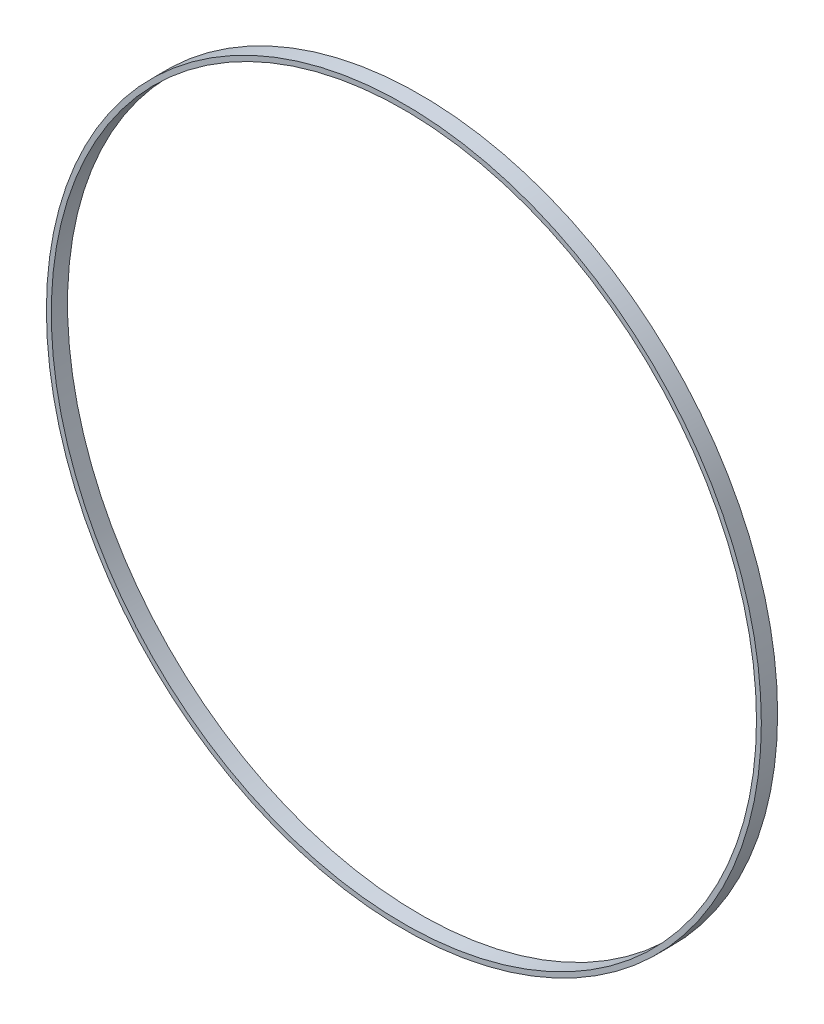
ISO-10303-21;
HEADER;
FILE_DESCRIPTION(('STEP AP214'),'2;1');
FILE_NAME('part.step','',(''),(''),'','','');
FILE_SCHEMA(('AUTOMOTIVE_DESIGN { 1 0 10303 214 1 1 1 1 }'));
ENDSEC;
DATA;
#1=APPLICATION_CONTEXT('core data for automotive mechanical design processes');
#2=APPLICATION_PROTOCOL_DEFINITION('international standard','automotive_design',2000,#1);
#3=PRODUCT_CONTEXT('',#1,'mechanical');
#4=PRODUCT('Part','Part','',(#3));
#5=PRODUCT_RELATED_PRODUCT_CATEGORY('part','',(#4));
#6=PRODUCT_DEFINITION_FORMATION('','',#4);
#7=PRODUCT_DEFINITION_CONTEXT('part definition',#1,'design');
#8=PRODUCT_DEFINITION('design','',#6,#7);
#9=PRODUCT_DEFINITION_SHAPE('','',#8);
#10=(LENGTH_UNIT() NAMED_UNIT(*) SI_UNIT(.MILLI.,.METRE.));
#11=(NAMED_UNIT(*) PLANE_ANGLE_UNIT() SI_UNIT($,.RADIAN.));
#12=(NAMED_UNIT(*) SI_UNIT($,.STERADIAN.) SOLID_ANGLE_UNIT());
#13=UNCERTAINTY_MEASURE_WITH_UNIT(LENGTH_MEASURE(1.E-05),#10,'distance_accuracy_value','');
#14=(GEOMETRIC_REPRESENTATION_CONTEXT(3) GLOBAL_UNCERTAINTY_ASSIGNED_CONTEXT((#13)) GLOBAL_UNIT_ASSIGNED_CONTEXT((#10,
#11,#12)) REPRESENTATION_CONTEXT('',''));
#15=CARTESIAN_POINT('',(0.,0.,0.));
#16=DIRECTION('',(0.,0.,1.));
#17=DIRECTION('',(1.,0.,0.));
#18=AXIS2_PLACEMENT_3D('',#15,#16,#17);
#19=CARTESIAN_POINT('',(-1.25555384357766,8.3705165851716,-6.03584858589362));
#20=DIRECTION('',(0.,0.,1.));
#21=DIRECTION('',(1.,0.,0.));
#22=AXIS2_PLACEMENT_3D('',#19,#20,#21);
#23=CYLINDRICAL_SURFACE('',#22,6.50999999999936);
#24=CARTESIAN_POINT('',(-1.25555384357766,8.3705165851716,-6.03584858589362));
#25=DIRECTION('',(0.,0.,1.));
#26=DIRECTION('',(1.,0.,0.));
#27=AXIS2_PLACEMENT_3D('',#24,#25,#26);
#28=CIRCLE('',#27,6.50999999999936);
#29=CARTESIAN_POINT('',(5.2544461564217,8.3705165851716,-6.03584858589362));
#30=VERTEX_POINT('',#29);
#31=EDGE_CURVE('E20',#30,#30,#28,.T.);
#32=ORIENTED_EDGE('',*,*,#31,.F.);
#33=EDGE_LOOP('',(#32));
#34=FACE_BOUND('',#33,.T.);
#35=CARTESIAN_POINT('',(-1.25555384357766,8.3705165851716,-5.73584858589482));
#36=DIRECTION('',(0.,0.,1.));
#37=DIRECTION('',(1.,0.,0.));
#38=AXIS2_PLACEMENT_3D('',#35,#36,#37);
#39=CIRCLE('',#38,6.50999999999936);
#40=CARTESIAN_POINT('',(5.2544461564217,8.3705165851716,-5.73584858589482));
#41=VERTEX_POINT('',#40);
#42=EDGE_CURVE('E29',#41,#41,#39,.F.);
#43=ORIENTED_EDGE('',*,*,#42,.F.);
#44=EDGE_LOOP('',(#43));
#45=FACE_BOUND('',#44,.T.);
#46=ADVANCED_FACE('F17',(#34,#45),#23,.F.);
#47=CARTESIAN_POINT('',(-1.25555384357766,8.3705165851716,-6.03584858589362));
#48=DIRECTION('',(0.,0.,-1.));
#49=DIRECTION('',(-1.,0.,0.));
#50=AXIS2_PLACEMENT_3D('',#47,#48,#49);
#51=PLANE('',#50);
#52=ORIENTED_EDGE('',*,*,#31,.T.);
#53=EDGE_LOOP('',(#52));
#54=FACE_BOUND('',#53,.T.);
#55=CARTESIAN_POINT('',(-1.25555384357766,8.3705165851716,-6.03584858589362));
#56=DIRECTION('',(0.,0.,1.));
#57=DIRECTION('',(1.,0.,0.));
#58=AXIS2_PLACEMENT_3D('',#55,#56,#57);
#59=CIRCLE('',#58,6.599999999999);
#60=CARTESIAN_POINT('',(5.34444615642134,8.3705165851716,-6.03584858589362));
#61=VERTEX_POINT('',#60);
#62=EDGE_CURVE('E24',#61,#61,#59,.T.);
#63=ORIENTED_EDGE('',*,*,#62,.F.);
#64=EDGE_LOOP('',(#63));
#65=FACE_BOUND('',#64,.T.);
#66=ADVANCED_FACE('F37',(#54,#65),#51,.T.);
#67=CARTESIAN_POINT('',(-1.25555384357766,8.3705165851716,-5.73584858589482));
#68=DIRECTION('',(0.,0.,1.));
#69=DIRECTION('',(1.,0.,0.));
#70=AXIS2_PLACEMENT_3D('',#67,#68,#69);
#71=PLANE('',#70);
#72=ORIENTED_EDGE('',*,*,#42,.T.);
#73=EDGE_LOOP('',(#72));
#74=FACE_BOUND('',#73,.T.);
#75=CARTESIAN_POINT('',(-1.25555384357766,8.3705165851716,-5.73584858589482));
#76=DIRECTION('',(0.,0.,1.));
#77=DIRECTION('',(1.,0.,0.));
#78=AXIS2_PLACEMENT_3D('',#75,#76,#77);
#79=CIRCLE('',#78,6.599999999999);
#80=CARTESIAN_POINT('',(5.34444615642134,8.3705165851716,-5.73584858589482));
#81=VERTEX_POINT('',#80);
#82=EDGE_CURVE('E10',#81,#81,#79,.F.);
#83=ORIENTED_EDGE('',*,*,#82,.F.);
#84=EDGE_LOOP('',(#83));
#85=FACE_BOUND('',#84,.T.);
#86=ADVANCED_FACE('F46',(#74,#85),#71,.T.);
#87=CARTESIAN_POINT('',(-1.25555384357766,8.3705165851716,-5.73584858589482));
#88=DIRECTION('',(0.,0.,1.));
#89=DIRECTION('',(1.,0.,0.));
#90=AXIS2_PLACEMENT_3D('',#87,#88,#89);
#91=CYLINDRICAL_SURFACE('',#90,6.599999999999);
#92=ORIENTED_EDGE('',*,*,#62,.T.);
#93=EDGE_LOOP('',(#92));
#94=FACE_BOUND('',#93,.T.);
#95=ORIENTED_EDGE('',*,*,#82,.T.);
#96=EDGE_LOOP('',(#95));
#97=FACE_BOUND('',#96,.T.);
#98=ADVANCED_FACE('F47',(#94,#97),#91,.T.);
#99=CLOSED_SHELL('',(#46,#66,#86,#98));
#100=MANIFOLD_SOLID_BREP('B1',#99);
#101=ADVANCED_BREP_SHAPE_REPRESENTATION('',(#18,#100),#14);
#102=SHAPE_DEFINITION_REPRESENTATION(#9,#101);
ENDSEC;
END-ISO-10303-21;
